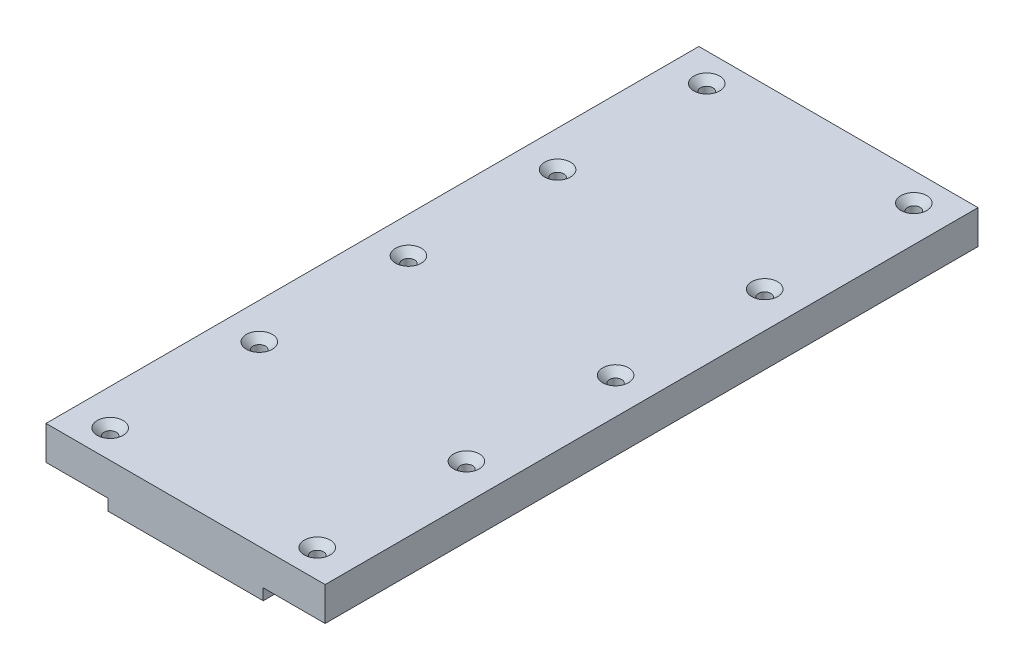
ISO-10303-21;
HEADER;
FILE_DESCRIPTION(('STEP AP214'),'2;1');
FILE_NAME('part.step','',(''),(''),'','','');
FILE_SCHEMA(('AUTOMOTIVE_DESIGN { 1 0 10303 214 1 1 1 1 }'));
ENDSEC;
DATA;
#1=APPLICATION_CONTEXT('core data for automotive mechanical design processes');
#2=APPLICATION_PROTOCOL_DEFINITION('international standard','automotive_design',2000,#1);
#3=PRODUCT_CONTEXT('',#1,'mechanical');
#4=PRODUCT('Part','Part','',(#3));
#5=PRODUCT_RELATED_PRODUCT_CATEGORY('part','',(#4));
#6=PRODUCT_DEFINITION_FORMATION('','',#4);
#7=PRODUCT_DEFINITION_CONTEXT('part definition',#1,'design');
#8=PRODUCT_DEFINITION('design','',#6,#7);
#9=PRODUCT_DEFINITION_SHAPE('','',#8);
#10=(LENGTH_UNIT() NAMED_UNIT(*) SI_UNIT(.MILLI.,.METRE.));
#11=(NAMED_UNIT(*) PLANE_ANGLE_UNIT() SI_UNIT($,.RADIAN.));
#12=(NAMED_UNIT(*) SI_UNIT($,.STERADIAN.) SOLID_ANGLE_UNIT());
#13=UNCERTAINTY_MEASURE_WITH_UNIT(LENGTH_MEASURE(1.E-05),#10,'distance_accuracy_value','');
#14=(GEOMETRIC_REPRESENTATION_CONTEXT(3) GLOBAL_UNCERTAINTY_ASSIGNED_CONTEXT((#13)) GLOBAL_UNIT_ASSIGNED_CONTEXT((#10,
#11,#12)) REPRESENTATION_CONTEXT('',''));
#15=CARTESIAN_POINT('',(0.,0.,0.));
#16=DIRECTION('',(0.,0.,1.));
#17=DIRECTION('',(1.,0.,0.));
#18=AXIS2_PLACEMENT_3D('',#15,#16,#17);
#19=CARTESIAN_POINT('',(0.,30.,-580.));
#20=DIRECTION('',(1.,0.,0.));
#21=DIRECTION('',(0.,0.,-1.));
#22=AXIS2_PLACEMENT_3D('',#19,#20,#21);
#23=PLANE('',#22);
#24=DIRECTION('',(0.,1.,0.));
#25=VECTOR('',#24,1.);
#26=CARTESIAN_POINT('',(0.,30.,0.));
#27=LINE('',#26,#25);
#28=CARTESIAN_POINT('',(0.,0.,0.));
#29=VERTEX_POINT('',#28);
#30=CARTESIAN_POINT('',(0.,30.,0.));
#31=VERTEX_POINT('',#30);
#32=EDGE_CURVE('E141',#29,#31,#27,.T.);
#33=ORIENTED_EDGE('',*,*,#32,.F.);
#34=DIRECTION('',(0.,0.,1.));
#35=VECTOR('',#34,1.);
#36=CARTESIAN_POINT('',(0.,0.,-580.));
#37=LINE('',#36,#35);
#38=CARTESIAN_POINT('',(0.,0.,-580.));
#39=VERTEX_POINT('',#38);
#40=EDGE_CURVE('E58',#39,#29,#37,.T.);
#41=ORIENTED_EDGE('',*,*,#40,.F.);
#42=DIRECTION('',(0.,1.,0.));
#43=VECTOR('',#42,1.);
#44=CARTESIAN_POINT('',(0.,30.,-580.));
#45=LINE('',#44,#43);
#46=CARTESIAN_POINT('',(0.,30.,-580.));
#47=VERTEX_POINT('',#46);
#48=EDGE_CURVE('E163',#39,#47,#45,.T.);
#49=ORIENTED_EDGE('',*,*,#48,.T.);
#50=DIRECTION('',(0.,0.,1.));
#51=VECTOR('',#50,1.);
#52=CARTESIAN_POINT('',(0.,30.,-580.));
#53=LINE('',#52,#51);
#54=EDGE_CURVE('E99',#47,#31,#53,.T.);
#55=ORIENTED_EDGE('',*,*,#54,.T.);
#56=EDGE_LOOP('',(#33,#41,#49,#55));
#57=FACE_BOUND('',#56,.T.);
#58=ADVANCED_FACE('F40',(#57),#23,.T.);
#59=CARTESIAN_POINT('',(0.,0.,-580.));
#60=DIRECTION('',(0.,-1.,0.));
#61=DIRECTION('',(0.,0.,-1.));
#62=AXIS2_PLACEMENT_3D('',#59,#60,#61);
#63=PLANE('',#62);
#64=CARTESIAN_POINT('',(-31.9999999999945,0.,-24.9999999999999));
#65=DIRECTION('',(0.,-1.,0.));
#66=DIRECTION('',(0.,0.,-1.));
#67=AXIS2_PLACEMENT_3D('',#64,#65,#66);
#68=CIRCLE('',#67,5.50000000000002);
#69=CARTESIAN_POINT('',(-31.9999999999945,0.,-30.4999999999999));
#70=VERTEX_POINT('',#69);
#71=EDGE_CURVE('E329',#70,#70,#68,.F.);
#72=ORIENTED_EDGE('',*,*,#71,.T.);
#73=EDGE_LOOP('',(#72));
#74=FACE_BOUND('',#73,.T.);
#75=CARTESIAN_POINT('',(-31.9999999999959,0.,-157.5));
#76=DIRECTION('',(0.,-1.,0.));
#77=DIRECTION('',(0.,0.,-1.));
#78=AXIS2_PLACEMENT_3D('',#75,#76,#77);
#79=CIRCLE('',#78,5.50000000000002);
#80=CARTESIAN_POINT('',(-31.9999999999959,0.,-163.));
#81=VERTEX_POINT('',#80);
#82=EDGE_CURVE('E333',#81,#81,#79,.F.);
#83=ORIENTED_EDGE('',*,*,#82,.T.);
#84=EDGE_LOOP('',(#83));
#85=FACE_BOUND('',#84,.T.);
#86=CARTESIAN_POINT('',(-31.9999999999973,0.,-290.));
#87=DIRECTION('',(0.,-1.,0.));
#88=DIRECTION('',(0.,0.,-1.));
#89=AXIS2_PLACEMENT_3D('',#86,#87,#88);
#90=CIRCLE('',#89,5.50000000000002);
#91=CARTESIAN_POINT('',(-31.9999999999973,0.,-295.5));
#92=VERTEX_POINT('',#91);
#93=EDGE_CURVE('E346',#92,#92,#90,.F.);
#94=ORIENTED_EDGE('',*,*,#93,.T.);
#95=EDGE_LOOP('',(#94));
#96=FACE_BOUND('',#95,.T.);
#97=CARTESIAN_POINT('',(-31.9999999999986,0.,-422.5));
#98=DIRECTION('',(0.,-1.,0.));
#99=DIRECTION('',(0.,0.,-1.));
#100=AXIS2_PLACEMENT_3D('',#97,#98,#99);
#101=CIRCLE('',#100,5.50000000000002);
#102=CARTESIAN_POINT('',(-31.9999999999986,0.,-428.));
#103=VERTEX_POINT('',#102);
#104=EDGE_CURVE('E343',#103,#103,#101,.F.);
#105=ORIENTED_EDGE('',*,*,#104,.T.);
#106=EDGE_LOOP('',(#105));
#107=FACE_BOUND('',#106,.T.);
#108=CARTESIAN_POINT('',(-32.,0.,-555.));
#109=DIRECTION('',(0.,-1.,0.));
#110=DIRECTION('',(0.,0.,-1.));
#111=AXIS2_PLACEMENT_3D('',#108,#109,#110);
#112=CIRCLE('',#111,5.50000000000002);
#113=CARTESIAN_POINT('',(-32.,0.,-560.5));
#114=VERTEX_POINT('',#113);
#115=EDGE_CURVE('E340',#114,#114,#112,.F.);
#116=ORIENTED_EDGE('',*,*,#115,.T.);
#117=EDGE_LOOP('',(#116));
#118=FACE_BOUND('',#117,.T.);
#119=DIRECTION('',(1.,0.,0.));
#120=VECTOR('',#119,1.);
#121=CARTESIAN_POINT('',(0.,0.,0.));
#122=LINE('',#121,#120);
#123=CARTESIAN_POINT('',(-55.,0.,0.));
#124=VERTEX_POINT('',#123);
#125=EDGE_CURVE('E160',#124,#29,#122,.T.);
#126=ORIENTED_EDGE('',*,*,#125,.F.);
#127=DIRECTION('',(0.,0.,1.));
#128=VECTOR('',#127,1.);
#129=CARTESIAN_POINT('',(-55.,0.,-580.));
#130=LINE('',#129,#128);
#131=CARTESIAN_POINT('',(-55.,0.,-580.));
#132=VERTEX_POINT('',#131);
#133=EDGE_CURVE('E87',#132,#124,#130,.T.);
#134=ORIENTED_EDGE('',*,*,#133,.F.);
#135=DIRECTION('',(1.,0.,0.));
#136=VECTOR('',#135,1.);
#137=CARTESIAN_POINT('',(0.,0.,-580.));
#138=LINE('',#137,#136);
#139=EDGE_CURVE('E131',#132,#39,#138,.T.);
#140=ORIENTED_EDGE('',*,*,#139,.T.);
#141=ORIENTED_EDGE('',*,*,#40,.T.);
#142=EDGE_LOOP('',(#126,#134,#140,#141));
#143=FACE_BOUND('',#142,.T.);
#144=ADVANCED_FACE('F248',(#74,#85,#96,#107,#118,#143),#63,.T.);
#145=CARTESIAN_POINT('',(-55.,0.,-580.));
#146=DIRECTION('',(1.,0.,0.));
#147=DIRECTION('',(0.,0.,-1.));
#148=AXIS2_PLACEMENT_3D('',#145,#146,#147);
#149=PLANE('',#148);
#150=DIRECTION('',(0.,1.,0.));
#151=VECTOR('',#150,1.);
#152=CARTESIAN_POINT('',(-55.,0.,0.));
#153=LINE('',#152,#151);
#154=CARTESIAN_POINT('',(-55.,-10.,0.));
#155=VERTEX_POINT('',#154);
#156=EDGE_CURVE('E118',#155,#124,#153,.T.);
#157=ORIENTED_EDGE('',*,*,#156,.F.);
#158=DIRECTION('',(0.,0.,1.));
#159=VECTOR('',#158,1.);
#160=CARTESIAN_POINT('',(-55.,-10.,-580.));
#161=LINE('',#160,#159);
#162=CARTESIAN_POINT('',(-55.,-10.,-580.));
#163=VERTEX_POINT('',#162);
#164=EDGE_CURVE('E113',#163,#155,#161,.T.);
#165=ORIENTED_EDGE('',*,*,#164,.F.);
#166=DIRECTION('',(0.,1.,0.));
#167=VECTOR('',#166,1.);
#168=CARTESIAN_POINT('',(-55.,0.,-580.));
#169=LINE('',#168,#167);
#170=EDGE_CURVE('E116',#163,#132,#169,.T.);
#171=ORIENTED_EDGE('',*,*,#170,.T.);
#172=ORIENTED_EDGE('',*,*,#133,.T.);
#173=EDGE_LOOP('',(#157,#165,#171,#172));
#174=FACE_BOUND('',#173,.T.);
#175=ADVANCED_FACE('F115',(#174),#149,.T.);
#176=CARTESIAN_POINT('',(-55.,-10.,-580.));
#177=DIRECTION('',(0.,-1.,0.));
#178=DIRECTION('',(0.,0.,-1.));
#179=AXIS2_PLACEMENT_3D('',#176,#177,#178);
#180=PLANE('',#179);
#181=DIRECTION('',(1.,0.,0.));
#182=VECTOR('',#181,1.);
#183=CARTESIAN_POINT('',(-55.,-10.,0.));
#184=LINE('',#183,#182);
#185=CARTESIAN_POINT('',(-193.,-10.,0.));
#186=VERTEX_POINT('',#185);
#187=EDGE_CURVE('E157',#186,#155,#184,.T.);
#188=ORIENTED_EDGE('',*,*,#187,.F.);
#189=DIRECTION('',(0.,0.,1.));
#190=VECTOR('',#189,1.);
#191=CARTESIAN_POINT('',(-193.,-10.,-580.));
#192=LINE('',#191,#190);
#193=CARTESIAN_POINT('',(-193.,-10.,-580.));
#194=VERTEX_POINT('',#193);
#195=EDGE_CURVE('E123',#194,#186,#192,.T.);
#196=ORIENTED_EDGE('',*,*,#195,.F.);
#197=DIRECTION('',(1.,0.,0.));
#198=VECTOR('',#197,1.);
#199=CARTESIAN_POINT('',(-55.,-10.,-580.));
#200=LINE('',#199,#198);
#201=EDGE_CURVE('E129',#194,#163,#200,.T.);
#202=ORIENTED_EDGE('',*,*,#201,.T.);
#203=ORIENTED_EDGE('',*,*,#164,.T.);
#204=EDGE_LOOP('',(#188,#196,#202,#203));
#205=FACE_BOUND('',#204,.T.);
#206=ADVANCED_FACE('F133',(#205),#180,.T.);
#207=CARTESIAN_POINT('',(-193.,-10.,-580.));
#208=DIRECTION('',(-1.,0.,0.));
#209=DIRECTION('',(0.,0.,1.));
#210=AXIS2_PLACEMENT_3D('',#207,#208,#209);
#211=PLANE('',#210);
#212=DIRECTION('',(0.,-1.,0.));
#213=VECTOR('',#212,1.);
#214=CARTESIAN_POINT('',(-193.,-10.,0.));
#215=LINE('',#214,#213);
#216=CARTESIAN_POINT('',(-193.,0.,0.));
#217=VERTEX_POINT('',#216);
#218=EDGE_CURVE('E154',#217,#186,#215,.T.);
#219=ORIENTED_EDGE('',*,*,#218,.F.);
#220=DIRECTION('',(0.,0.,1.));
#221=VECTOR('',#220,1.);
#222=CARTESIAN_POINT('',(-193.,0.,-580.));
#223=LINE('',#222,#221);
#224=CARTESIAN_POINT('',(-193.,0.,-580.));
#225=VERTEX_POINT('',#224);
#226=EDGE_CURVE('E168',#225,#217,#223,.T.);
#227=ORIENTED_EDGE('',*,*,#226,.F.);
#228=DIRECTION('',(0.,-1.,0.));
#229=VECTOR('',#228,1.);
#230=CARTESIAN_POINT('',(-193.,-10.,-580.));
#231=LINE('',#230,#229);
#232=EDGE_CURVE('E134',#225,#194,#231,.T.);
#233=ORIENTED_EDGE('',*,*,#232,.T.);
#234=ORIENTED_EDGE('',*,*,#195,.T.);
#235=EDGE_LOOP('',(#219,#227,#233,#234));
#236=FACE_BOUND('',#235,.T.);
#237=ADVANCED_FACE('F371',(#236),#211,.T.);
#238=CARTESIAN_POINT('',(-193.,0.,-580.));
#239=DIRECTION('',(0.,-1.,0.));
#240=DIRECTION('',(0.,0.,-1.));
#241=AXIS2_PLACEMENT_3D('',#238,#239,#240);
#242=PLANE('',#241);
#243=CARTESIAN_POINT('',(-215.999999999999,0.,-422.5));
#244=DIRECTION('',(0.,-1.,0.));
#245=DIRECTION('',(0.,0.,-1.));
#246=AXIS2_PLACEMENT_3D('',#243,#244,#245);
#247=CIRCLE('',#246,5.50000000000002);
#248=CARTESIAN_POINT('',(-215.999999999999,0.,-428.));
#249=VERTEX_POINT('',#248);
#250=EDGE_CURVE('E327',#249,#249,#247,.F.);
#251=ORIENTED_EDGE('',*,*,#250,.T.);
#252=EDGE_LOOP('',(#251));
#253=FACE_BOUND('',#252,.T.);
#254=CARTESIAN_POINT('',(-215.999999999997,0.,-290.));
#255=DIRECTION('',(0.,-1.,0.));
#256=DIRECTION('',(0.,0.,-1.));
#257=AXIS2_PLACEMENT_3D('',#254,#255,#256);
#258=CIRCLE('',#257,5.50000000000002);
#259=CARTESIAN_POINT('',(-215.999999999997,0.,-295.5));
#260=VERTEX_POINT('',#259);
#261=EDGE_CURVE('E330',#260,#260,#258,.F.);
#262=ORIENTED_EDGE('',*,*,#261,.T.);
#263=EDGE_LOOP('',(#262));
#264=FACE_BOUND('',#263,.T.);
#265=CARTESIAN_POINT('',(-215.999999999996,0.,-157.5));
#266=DIRECTION('',(0.,-1.,0.));
#267=DIRECTION('',(0.,0.,-1.));
#268=AXIS2_PLACEMENT_3D('',#265,#266,#267);
#269=CIRCLE('',#268,5.50000000000002);
#270=CARTESIAN_POINT('',(-215.999999999996,0.,-163.));
#271=VERTEX_POINT('',#270);
#272=EDGE_CURVE('E336',#271,#271,#269,.F.);
#273=ORIENTED_EDGE('',*,*,#272,.T.);
#274=EDGE_LOOP('',(#273));
#275=FACE_BOUND('',#274,.T.);
#276=CARTESIAN_POINT('',(-215.999999999994,0.,-24.9999999999999));
#277=DIRECTION('',(0.,-1.,0.));
#278=DIRECTION('',(0.,0.,-1.));
#279=AXIS2_PLACEMENT_3D('',#276,#277,#278);
#280=CIRCLE('',#279,5.50000000000002);
#281=CARTESIAN_POINT('',(-215.999999999994,0.,-30.4999999999999));
#282=VERTEX_POINT('',#281);
#283=EDGE_CURVE('E418',#282,#282,#280,.F.);
#284=ORIENTED_EDGE('',*,*,#283,.T.);
#285=EDGE_LOOP('',(#284));
#286=FACE_BOUND('',#285,.T.);
#287=CARTESIAN_POINT('',(-216.,0.,-555.));
#288=DIRECTION('',(0.,-1.,0.));
#289=DIRECTION('',(0.,0.,-1.));
#290=AXIS2_PLACEMENT_3D('',#287,#288,#289);
#291=CIRCLE('',#290,5.50000000000002);
#292=CARTESIAN_POINT('',(-216.,0.,-560.5));
#293=VERTEX_POINT('',#292);
#294=EDGE_CURVE('E145',#293,#293,#291,.F.);
#295=ORIENTED_EDGE('',*,*,#294,.T.);
#296=EDGE_LOOP('',(#295));
#297=FACE_BOUND('',#296,.T.);
#298=DIRECTION('',(1.,0.,0.));
#299=VECTOR('',#298,1.);
#300=CARTESIAN_POINT('',(-193.,0.,0.));
#301=LINE('',#300,#299);
#302=CARTESIAN_POINT('',(-248.,0.,0.));
#303=VERTEX_POINT('',#302);
#304=EDGE_CURVE('E151',#303,#217,#301,.T.);
#305=ORIENTED_EDGE('',*,*,#304,.F.);
#306=DIRECTION('',(0.,0.,1.));
#307=VECTOR('',#306,1.);
#308=CARTESIAN_POINT('',(-248.,0.,-580.));
#309=LINE('',#308,#307);
#310=CARTESIAN_POINT('',(-248.,0.,-580.));
#311=VERTEX_POINT('',#310);
#312=EDGE_CURVE('E170',#311,#303,#309,.T.);
#313=ORIENTED_EDGE('',*,*,#312,.F.);
#314=DIRECTION('',(1.,0.,0.));
#315=VECTOR('',#314,1.);
#316=CARTESIAN_POINT('',(-193.,0.,-580.));
#317=LINE('',#316,#315);
#318=EDGE_CURVE('E136',#311,#225,#317,.T.);
#319=ORIENTED_EDGE('',*,*,#318,.T.);
#320=ORIENTED_EDGE('',*,*,#226,.T.);
#321=EDGE_LOOP('',(#305,#313,#319,#320));
#322=FACE_BOUND('',#321,.T.);
#323=ADVANCED_FACE('F362',(#253,#264,#275,#286,#297,#322),#242,.T.);
#324=CARTESIAN_POINT('',(-248.,0.,-580.));
#325=DIRECTION('',(-1.,0.,0.));
#326=DIRECTION('',(0.,0.,1.));
#327=AXIS2_PLACEMENT_3D('',#324,#325,#326);
#328=PLANE('',#327);
#329=DIRECTION('',(0.,-1.,0.));
#330=VECTOR('',#329,1.);
#331=CARTESIAN_POINT('',(-248.,0.,0.));
#332=LINE('',#331,#330);
#333=CARTESIAN_POINT('',(-248.,30.,0.));
#334=VERTEX_POINT('',#333);
#335=EDGE_CURVE('E148',#334,#303,#332,.T.);
#336=ORIENTED_EDGE('',*,*,#335,.F.);
#337=DIRECTION('',(0.,0.,1.));
#338=VECTOR('',#337,1.);
#339=CARTESIAN_POINT('',(-248.,30.,-580.));
#340=LINE('',#339,#338);
#341=CARTESIAN_POINT('',(-248.,30.,-580.));
#342=VERTEX_POINT('',#341);
#343=EDGE_CURVE('E172',#342,#334,#340,.T.);
#344=ORIENTED_EDGE('',*,*,#343,.F.);
#345=DIRECTION('',(0.,-1.,0.));
#346=VECTOR('',#345,1.);
#347=CARTESIAN_POINT('',(-248.,0.,-580.));
#348=LINE('',#347,#346);
#349=EDGE_CURVE('E356',#342,#311,#348,.T.);
#350=ORIENTED_EDGE('',*,*,#349,.T.);
#351=ORIENTED_EDGE('',*,*,#312,.T.);
#352=EDGE_LOOP('',(#336,#344,#350,#351));
#353=FACE_BOUND('',#352,.T.);
#354=ADVANCED_FACE('F367',(#353),#328,.T.);
#355=CARTESIAN_POINT('',(-248.,30.,-580.));
#356=DIRECTION('',(0.,1.,0.));
#357=DIRECTION('',(0.,0.,1.));
#358=AXIS2_PLACEMENT_3D('',#355,#356,#357);
#359=PLANE('',#358);
#360=CARTESIAN_POINT('',(-31.9999999999945,30.,-24.9999999999999));
#361=DIRECTION('',(0.,1.,0.));
#362=DIRECTION('',(0.,0.,1.));
#363=AXIS2_PLACEMENT_3D('',#360,#361,#362);
#364=CIRCLE('',#363,11.5000000000002);
#365=CARTESIAN_POINT('',(-31.9999999999945,30.,-13.4999999999997));
#366=VERTEX_POINT('',#365);
#367=EDGE_CURVE('E204',#366,#366,#364,.F.);
#368=ORIENTED_EDGE('',*,*,#367,.T.);
#369=EDGE_LOOP('',(#368));
#370=FACE_BOUND('',#369,.T.);
#371=CARTESIAN_POINT('',(-31.9999999999959,30.,-157.5));
#372=DIRECTION('',(0.,1.,0.));
#373=DIRECTION('',(0.,0.,1.));
#374=AXIS2_PLACEMENT_3D('',#371,#372,#373);
#375=CIRCLE('',#374,11.5000000000002);
#376=CARTESIAN_POINT('',(-31.9999999999959,30.,-146.));
#377=VERTEX_POINT('',#376);
#378=EDGE_CURVE('E201',#377,#377,#375,.F.);
#379=ORIENTED_EDGE('',*,*,#378,.T.);
#380=EDGE_LOOP('',(#379));
#381=FACE_BOUND('',#380,.T.);
#382=CARTESIAN_POINT('',(-31.9999999999973,30.,-290.));
#383=DIRECTION('',(0.,1.,0.));
#384=DIRECTION('',(0.,0.,1.));
#385=AXIS2_PLACEMENT_3D('',#382,#383,#384);
#386=CIRCLE('',#385,11.5);
#387=CARTESIAN_POINT('',(-31.9999999999973,30.,-278.5));
#388=VERTEX_POINT('',#387);
#389=EDGE_CURVE('E198',#388,#388,#386,.F.);
#390=ORIENTED_EDGE('',*,*,#389,.T.);
#391=EDGE_LOOP('',(#390));
#392=FACE_BOUND('',#391,.T.);
#393=CARTESIAN_POINT('',(-31.9999999999986,30.,-422.5));
#394=DIRECTION('',(0.,1.,0.));
#395=DIRECTION('',(0.,0.,1.));
#396=AXIS2_PLACEMENT_3D('',#393,#394,#395);
#397=CIRCLE('',#396,11.5000000000002);
#398=CARTESIAN_POINT('',(-31.9999999999986,30.,-411.));
#399=VERTEX_POINT('',#398);
#400=EDGE_CURVE('E195',#399,#399,#397,.F.);
#401=ORIENTED_EDGE('',*,*,#400,.T.);
#402=EDGE_LOOP('',(#401));
#403=FACE_BOUND('',#402,.T.);
#404=CARTESIAN_POINT('',(-32.,30.,-555.));
#405=DIRECTION('',(0.,1.,0.));
#406=DIRECTION('',(0.,0.,1.));
#407=AXIS2_PLACEMENT_3D('',#404,#405,#406);
#408=CIRCLE('',#407,11.5000000000001);
#409=CARTESIAN_POINT('',(-32.,30.,-543.5));
#410=VERTEX_POINT('',#409);
#411=EDGE_CURVE('E192',#410,#410,#408,.F.);
#412=ORIENTED_EDGE('',*,*,#411,.T.);
#413=EDGE_LOOP('',(#412));
#414=FACE_BOUND('',#413,.T.);
#415=CARTESIAN_POINT('',(-216.,30.,-555.));
#416=DIRECTION('',(0.,1.,0.));
#417=DIRECTION('',(0.,0.,1.));
#418=AXIS2_PLACEMENT_3D('',#415,#416,#417);
#419=CIRCLE('',#418,11.5000000000001);
#420=CARTESIAN_POINT('',(-216.,30.,-543.5));
#421=VERTEX_POINT('',#420);
#422=EDGE_CURVE('E189',#421,#421,#419,.F.);
#423=ORIENTED_EDGE('',*,*,#422,.T.);
#424=EDGE_LOOP('',(#423));
#425=FACE_BOUND('',#424,.T.);
#426=CARTESIAN_POINT('',(-215.999999999999,30.,-422.5));
#427=DIRECTION('',(0.,1.,0.));
#428=DIRECTION('',(0.,0.,1.));
#429=AXIS2_PLACEMENT_3D('',#426,#427,#428);
#430=CIRCLE('',#429,11.5000000000002);
#431=CARTESIAN_POINT('',(-215.999999999999,30.,-411.));
#432=VERTEX_POINT('',#431);
#433=EDGE_CURVE('E186',#432,#432,#430,.F.);
#434=ORIENTED_EDGE('',*,*,#433,.T.);
#435=EDGE_LOOP('',(#434));
#436=FACE_BOUND('',#435,.T.);
#437=CARTESIAN_POINT('',(-215.999999999997,30.,-290.));
#438=DIRECTION('',(0.,1.,0.));
#439=DIRECTION('',(0.,0.,1.));
#440=AXIS2_PLACEMENT_3D('',#437,#438,#439);
#441=CIRCLE('',#440,11.5);
#442=CARTESIAN_POINT('',(-215.999999999997,30.,-278.5));
#443=VERTEX_POINT('',#442);
#444=EDGE_CURVE('E183',#443,#443,#441,.F.);
#445=ORIENTED_EDGE('',*,*,#444,.T.);
#446=EDGE_LOOP('',(#445));
#447=FACE_BOUND('',#446,.T.);
#448=CARTESIAN_POINT('',(-215.999999999996,30.,-157.5));
#449=DIRECTION('',(0.,1.,0.));
#450=DIRECTION('',(0.,0.,1.));
#451=AXIS2_PLACEMENT_3D('',#448,#449,#450);
#452=CIRCLE('',#451,11.5000000000002);
#453=CARTESIAN_POINT('',(-215.999999999996,30.,-146.));
#454=VERTEX_POINT('',#453);
#455=EDGE_CURVE('E180',#454,#454,#452,.F.);
#456=ORIENTED_EDGE('',*,*,#455,.T.);
#457=EDGE_LOOP('',(#456));
#458=FACE_BOUND('',#457,.T.);
#459=CARTESIAN_POINT('',(-215.999999999994,30.,-24.9999999999999));
#460=DIRECTION('',(0.,1.,0.));
#461=DIRECTION('',(0.,0.,1.));
#462=AXIS2_PLACEMENT_3D('',#459,#460,#461);
#463=CIRCLE('',#462,11.5000000000002);
#464=CARTESIAN_POINT('',(-215.999999999994,30.,-13.4999999999997));
#465=VERTEX_POINT('',#464);
#466=EDGE_CURVE('E177',#465,#465,#463,.F.);
#467=ORIENTED_EDGE('',*,*,#466,.T.);
#468=EDGE_LOOP('',(#467));
#469=FACE_BOUND('',#468,.T.);
#470=DIRECTION('',(-1.,0.,0.));
#471=VECTOR('',#470,1.);
#472=CARTESIAN_POINT('',(-248.,30.,0.));
#473=LINE('',#472,#471);
#474=EDGE_CURVE('E144',#31,#334,#473,.T.);
#475=ORIENTED_EDGE('',*,*,#474,.F.);
#476=ORIENTED_EDGE('',*,*,#54,.F.);
#477=DIRECTION('',(-1.,0.,0.));
#478=VECTOR('',#477,1.);
#479=CARTESIAN_POINT('',(-248.,30.,-580.));
#480=LINE('',#479,#478);
#481=EDGE_CURVE('E354',#47,#342,#480,.T.);
#482=ORIENTED_EDGE('',*,*,#481,.T.);
#483=ORIENTED_EDGE('',*,*,#343,.T.);
#484=EDGE_LOOP('',(#475,#476,#482,#483));
#485=FACE_BOUND('',#484,.T.);
#486=ADVANCED_FACE('F257',(#370,#381,#392,#403,#414,#425,#436,#447,#458,#469,#485),#359,.T.);
#487=CARTESIAN_POINT('',(0.,0.,-580.));
#488=DIRECTION('',(0.,0.,-1.));
#489=DIRECTION('',(-1.,0.,0.));
#490=AXIS2_PLACEMENT_3D('',#487,#488,#489);
#491=PLANE('',#490);
#492=ORIENTED_EDGE('',*,*,#48,.F.);
#493=ORIENTED_EDGE('',*,*,#139,.F.);
#494=ORIENTED_EDGE('',*,*,#170,.F.);
#495=ORIENTED_EDGE('',*,*,#201,.F.);
#496=ORIENTED_EDGE('',*,*,#232,.F.);
#497=ORIENTED_EDGE('',*,*,#318,.F.);
#498=ORIENTED_EDGE('',*,*,#349,.F.);
#499=ORIENTED_EDGE('',*,*,#481,.F.);
#500=EDGE_LOOP('',(#492,#493,#494,#495,#496,#497,#498,#499));
#501=FACE_BOUND('',#500,.T.);
#502=ADVANCED_FACE('F127',(#501),#491,.T.);
#503=CARTESIAN_POINT('',(0.,0.,0.));
#504=DIRECTION('',(0.,0.,-1.));
#505=DIRECTION('',(-1.,0.,0.));
#506=AXIS2_PLACEMENT_3D('',#503,#504,#505);
#507=PLANE('',#506);
#508=ORIENTED_EDGE('',*,*,#32,.T.);
#509=ORIENTED_EDGE('',*,*,#474,.T.);
#510=ORIENTED_EDGE('',*,*,#335,.T.);
#511=ORIENTED_EDGE('',*,*,#304,.T.);
#512=ORIENTED_EDGE('',*,*,#218,.T.);
#513=ORIENTED_EDGE('',*,*,#187,.T.);
#514=ORIENTED_EDGE('',*,*,#156,.T.);
#515=ORIENTED_EDGE('',*,*,#125,.T.);
#516=EDGE_LOOP('',(#508,#509,#510,#511,#512,#513,#514,#515));
#517=FACE_BOUND('',#516,.T.);
#518=ADVANCED_FACE('F369',(#517),#507,.F.);
#519=CARTESIAN_POINT('',(-216.,-10.001,-555.));
#520=DIRECTION('',(0.,1.,0.));
#521=DIRECTION('',(0.,0.,1.));
#522=AXIS2_PLACEMENT_3D('',#519,#520,#521);
#523=CYLINDRICAL_SURFACE('',#522,5.50000000000002);
#524=CARTESIAN_POINT('',(-216.,23.9999999999999,-555.));
#525=DIRECTION('',(0.,1.,0.));
#526=DIRECTION('',(0.,0.,1.));
#527=AXIS2_PLACEMENT_3D('',#524,#525,#526);
#528=CIRCLE('',#527,5.50000000000002);
#529=CARTESIAN_POINT('',(-216.,23.9999999999999,-549.5));
#530=VERTEX_POINT('',#529);
#531=EDGE_CURVE('E219',#530,#530,#528,.T.);
#532=ORIENTED_EDGE('',*,*,#531,.T.);
#533=EDGE_LOOP('',(#532));
#534=FACE_BOUND('',#533,.T.);
#535=ORIENTED_EDGE('',*,*,#294,.F.);
#536=EDGE_LOOP('',(#535));
#537=FACE_BOUND('',#536,.T.);
#538=ADVANCED_FACE('F414',(#534,#537),#523,.F.);
#539=CARTESIAN_POINT('',(-215.999999999994,-10.001,-24.9999999999999));
#540=DIRECTION('',(0.,1.,0.));
#541=DIRECTION('',(0.,0.,1.));
#542=AXIS2_PLACEMENT_3D('',#539,#540,#541);
#543=CYLINDRICAL_SURFACE('',#542,5.50000000000002);
#544=CARTESIAN_POINT('',(-215.999999999994,23.9999999999999,-24.9999999999999));
#545=DIRECTION('',(0.,1.,0.));
#546=DIRECTION('',(0.,0.,1.));
#547=AXIS2_PLACEMENT_3D('',#544,#545,#546);
#548=CIRCLE('',#547,5.50000000000002);
#549=CARTESIAN_POINT('',(-215.999999999994,23.9999999999999,-19.4999999999999));
#550=VERTEX_POINT('',#549);
#551=EDGE_CURVE('E11',#550,#550,#548,.T.);
#552=ORIENTED_EDGE('',*,*,#551,.T.);
#553=EDGE_LOOP('',(#552));
#554=FACE_BOUND('',#553,.T.);
#555=ORIENTED_EDGE('',*,*,#283,.F.);
#556=EDGE_LOOP('',(#555));
#557=FACE_BOUND('',#556,.T.);
#558=ADVANCED_FACE('F410',(#554,#557),#543,.F.);
#559=CARTESIAN_POINT('',(-32.,-10.001,-555.));
#560=DIRECTION('',(0.,1.,0.));
#561=DIRECTION('',(0.,0.,1.));
#562=AXIS2_PLACEMENT_3D('',#559,#560,#561);
#563=CYLINDRICAL_SURFACE('',#562,5.50000000000002);
#564=CARTESIAN_POINT('',(-32.,23.9999999999999,-555.));
#565=DIRECTION('',(0.,1.,0.));
#566=DIRECTION('',(0.,0.,1.));
#567=AXIS2_PLACEMENT_3D('',#564,#565,#566);
#568=CIRCLE('',#567,5.50000000000002);
#569=CARTESIAN_POINT('',(-32.,23.9999999999999,-549.5));
#570=VERTEX_POINT('',#569);
#571=EDGE_CURVE('E216',#570,#570,#568,.T.);
#572=ORIENTED_EDGE('',*,*,#571,.T.);
#573=EDGE_LOOP('',(#572));
#574=FACE_BOUND('',#573,.T.);
#575=ORIENTED_EDGE('',*,*,#115,.F.);
#576=EDGE_LOOP('',(#575));
#577=FACE_BOUND('',#576,.T.);
#578=ADVANCED_FACE('F413',(#574,#577),#563,.F.);
#579=CARTESIAN_POINT('',(-31.9999999999986,-10.001,-422.5));
#580=DIRECTION('',(0.,1.,0.));
#581=DIRECTION('',(0.,0.,1.));
#582=AXIS2_PLACEMENT_3D('',#579,#580,#581);
#583=CYLINDRICAL_SURFACE('',#582,5.50000000000002);
#584=CARTESIAN_POINT('',(-31.9999999999986,23.9999999999999,-422.5));
#585=DIRECTION('',(0.,1.,0.));
#586=DIRECTION('',(0.,0.,1.));
#587=AXIS2_PLACEMENT_3D('',#584,#585,#586);
#588=CIRCLE('',#587,5.50000000000002);
#589=CARTESIAN_POINT('',(-31.9999999999986,23.9999999999999,-417.));
#590=VERTEX_POINT('',#589);
#591=EDGE_CURVE('E213',#590,#590,#588,.T.);
#592=ORIENTED_EDGE('',*,*,#591,.T.);
#593=EDGE_LOOP('',(#592));
#594=FACE_BOUND('',#593,.T.);
#595=ORIENTED_EDGE('',*,*,#104,.F.);
#596=EDGE_LOOP('',(#595));
#597=FACE_BOUND('',#596,.T.);
#598=ADVANCED_FACE('F442',(#594,#597),#583,.F.);
#599=CARTESIAN_POINT('',(-31.9999999999973,-10.001,-290.));
#600=DIRECTION('',(0.,1.,0.));
#601=DIRECTION('',(0.,0.,1.));
#602=AXIS2_PLACEMENT_3D('',#599,#600,#601);
#603=CYLINDRICAL_SURFACE('',#602,5.50000000000002);
#604=CARTESIAN_POINT('',(-31.9999999999973,24.,-290.));
#605=DIRECTION('',(0.,1.,0.));
#606=DIRECTION('',(0.,0.,1.));
#607=AXIS2_PLACEMENT_3D('',#604,#605,#606);
#608=CIRCLE('',#607,5.50000000000002);
#609=CARTESIAN_POINT('',(-31.9999999999973,24.,-284.5));
#610=VERTEX_POINT('',#609);
#611=EDGE_CURVE('E210',#610,#610,#608,.T.);
#612=ORIENTED_EDGE('',*,*,#611,.T.);
#613=EDGE_LOOP('',(#612));
#614=FACE_BOUND('',#613,.T.);
#615=ORIENTED_EDGE('',*,*,#93,.F.);
#616=EDGE_LOOP('',(#615));
#617=FACE_BOUND('',#616,.T.);
#618=ADVANCED_FACE('F433',(#614,#617),#603,.F.);
#619=CARTESIAN_POINT('',(-31.9999999999959,-10.001,-157.5));
#620=DIRECTION('',(0.,1.,0.));
#621=DIRECTION('',(0.,0.,1.));
#622=AXIS2_PLACEMENT_3D('',#619,#620,#621);
#623=CYLINDRICAL_SURFACE('',#622,5.50000000000002);
#624=CARTESIAN_POINT('',(-31.9999999999959,23.9999999999999,-157.5));
#625=DIRECTION('',(0.,1.,0.));
#626=DIRECTION('',(0.,0.,1.));
#627=AXIS2_PLACEMENT_3D('',#624,#625,#626);
#628=CIRCLE('',#627,5.50000000000002);
#629=CARTESIAN_POINT('',(-31.9999999999959,23.9999999999999,-152.));
#630=VERTEX_POINT('',#629);
#631=EDGE_CURVE('E207',#630,#630,#628,.T.);
#632=ORIENTED_EDGE('',*,*,#631,.T.);
#633=EDGE_LOOP('',(#632));
#634=FACE_BOUND('',#633,.T.);
#635=ORIENTED_EDGE('',*,*,#82,.F.);
#636=EDGE_LOOP('',(#635));
#637=FACE_BOUND('',#636,.T.);
#638=ADVANCED_FACE('F425',(#634,#637),#623,.F.);
#639=CARTESIAN_POINT('',(-215.999999999996,-10.001,-157.5));
#640=DIRECTION('',(0.,1.,0.));
#641=DIRECTION('',(0.,0.,1.));
#642=AXIS2_PLACEMENT_3D('',#639,#640,#641);
#643=CYLINDRICAL_SURFACE('',#642,5.50000000000002);
#644=CARTESIAN_POINT('',(-215.999999999996,23.9999999999999,-157.5));
#645=DIRECTION('',(0.,1.,0.));
#646=DIRECTION('',(0.,0.,1.));
#647=AXIS2_PLACEMENT_3D('',#644,#645,#646);
#648=CIRCLE('',#647,5.50000000000002);
#649=CARTESIAN_POINT('',(-215.999999999996,23.9999999999999,-152.));
#650=VERTEX_POINT('',#649);
#651=EDGE_CURVE('E50',#650,#650,#648,.T.);
#652=ORIENTED_EDGE('',*,*,#651,.T.);
#653=EDGE_LOOP('',(#652));
#654=FACE_BOUND('',#653,.T.);
#655=ORIENTED_EDGE('',*,*,#272,.F.);
#656=EDGE_LOOP('',(#655));
#657=FACE_BOUND('',#656,.T.);
#658=ADVANCED_FACE('F230',(#654,#657),#643,.F.);
#659=CARTESIAN_POINT('',(-215.999999999997,-10.001,-290.));
#660=DIRECTION('',(0.,1.,0.));
#661=DIRECTION('',(0.,0.,1.));
#662=AXIS2_PLACEMENT_3D('',#659,#660,#661);
#663=CYLINDRICAL_SURFACE('',#662,5.50000000000002);
#664=CARTESIAN_POINT('',(-215.999999999997,24.,-290.));
#665=DIRECTION('',(0.,1.,0.));
#666=DIRECTION('',(0.,0.,1.));
#667=AXIS2_PLACEMENT_3D('',#664,#665,#666);
#668=CIRCLE('',#667,5.50000000000002);
#669=CARTESIAN_POINT('',(-215.999999999997,24.,-284.5));
#670=VERTEX_POINT('',#669);
#671=EDGE_CURVE('E225',#670,#670,#668,.T.);
#672=ORIENTED_EDGE('',*,*,#671,.T.);
#673=EDGE_LOOP('',(#672));
#674=FACE_BOUND('',#673,.T.);
#675=ORIENTED_EDGE('',*,*,#261,.F.);
#676=EDGE_LOOP('',(#675));
#677=FACE_BOUND('',#676,.T.);
#678=ADVANCED_FACE('F323',(#674,#677),#663,.F.);
#679=CARTESIAN_POINT('',(-215.999999999999,-10.001,-422.5));
#680=DIRECTION('',(0.,1.,0.));
#681=DIRECTION('',(0.,0.,1.));
#682=AXIS2_PLACEMENT_3D('',#679,#680,#681);
#683=CYLINDRICAL_SURFACE('',#682,5.50000000000002);
#684=CARTESIAN_POINT('',(-215.999999999999,23.9999999999999,-422.5));
#685=DIRECTION('',(0.,1.,0.));
#686=DIRECTION('',(0.,0.,1.));
#687=AXIS2_PLACEMENT_3D('',#684,#685,#686);
#688=CIRCLE('',#687,5.50000000000002);
#689=CARTESIAN_POINT('',(-215.999999999999,23.9999999999999,-417.));
#690=VERTEX_POINT('',#689);
#691=EDGE_CURVE('E222',#690,#690,#688,.T.);
#692=ORIENTED_EDGE('',*,*,#691,.T.);
#693=EDGE_LOOP('',(#692));
#694=FACE_BOUND('',#693,.T.);
#695=ORIENTED_EDGE('',*,*,#250,.F.);
#696=EDGE_LOOP('',(#695));
#697=FACE_BOUND('',#696,.T.);
#698=ADVANCED_FACE('F320',(#694,#697),#683,.F.);
#699=CARTESIAN_POINT('',(-31.9999999999945,-10.001,-24.9999999999999));
#700=DIRECTION('',(0.,1.,0.));
#701=DIRECTION('',(0.,0.,1.));
#702=AXIS2_PLACEMENT_3D('',#699,#700,#701);
#703=CYLINDRICAL_SURFACE('',#702,5.50000000000002);
#704=CARTESIAN_POINT('',(-31.9999999999945,23.9999999999999,-24.9999999999999));
#705=DIRECTION('',(0.,1.,0.));
#706=DIRECTION('',(0.,0.,1.));
#707=AXIS2_PLACEMENT_3D('',#704,#705,#706);
#708=CIRCLE('',#707,5.50000000000002);
#709=CARTESIAN_POINT('',(-31.9999999999945,23.9999999999999,-19.4999999999999));
#710=VERTEX_POINT('',#709);
#711=EDGE_CURVE('E165',#710,#710,#708,.T.);
#712=ORIENTED_EDGE('',*,*,#711,.T.);
#713=EDGE_LOOP('',(#712));
#714=FACE_BOUND('',#713,.T.);
#715=ORIENTED_EDGE('',*,*,#71,.F.);
#716=EDGE_LOOP('',(#715));
#717=FACE_BOUND('',#716,.T.);
#718=ADVANCED_FACE('F267',(#714,#717),#703,.F.);
#719=CARTESIAN_POINT('',(-31.9999999999945,23.9999999999999,-24.9999999999999));
#720=DIRECTION('',(0.,1.,0.));
#721=DIRECTION('',(0.,0.,1.));
#722=AXIS2_PLACEMENT_3D('',#719,#720,#721);
#723=CONICAL_SURFACE('',#722,5.50000000000002,0.785398163397451);
#724=ORIENTED_EDGE('',*,*,#367,.F.);
#725=EDGE_LOOP('',(#724));
#726=FACE_BOUND('',#725,.T.);
#727=ORIENTED_EDGE('',*,*,#711,.F.);
#728=EDGE_LOOP('',(#727));
#729=FACE_BOUND('',#728,.T.);
#730=ADVANCED_FACE('F260',(#726,#729),#723,.F.);
#731=CARTESIAN_POINT('',(-31.9999999999959,23.9999999999999,-157.5));
#732=DIRECTION('',(0.,1.,0.));
#733=DIRECTION('',(0.,0.,1.));
#734=AXIS2_PLACEMENT_3D('',#731,#732,#733);
#735=CONICAL_SURFACE('',#734,5.50000000000002,0.785398163397451);
#736=ORIENTED_EDGE('',*,*,#378,.F.);
#737=EDGE_LOOP('',(#736));
#738=FACE_BOUND('',#737,.T.);
#739=ORIENTED_EDGE('',*,*,#631,.F.);
#740=EDGE_LOOP('',(#739));
#741=FACE_BOUND('',#740,.T.);
#742=ADVANCED_FACE('F266',(#738,#741),#735,.F.);
#743=CARTESIAN_POINT('',(-31.9999999999973,24.,-290.));
#744=DIRECTION('',(0.,1.,0.));
#745=DIRECTION('',(0.,0.,1.));
#746=AXIS2_PLACEMENT_3D('',#743,#744,#745);
#747=CONICAL_SURFACE('',#746,5.50000000000002,0.785398163397451);
#748=ORIENTED_EDGE('',*,*,#389,.F.);
#749=EDGE_LOOP('',(#748));
#750=FACE_BOUND('',#749,.T.);
#751=ORIENTED_EDGE('',*,*,#611,.F.);
#752=EDGE_LOOP('',(#751));
#753=FACE_BOUND('',#752,.T.);
#754=ADVANCED_FACE('F274',(#750,#753),#747,.F.);
#755=CARTESIAN_POINT('',(-31.9999999999986,23.9999999999999,-422.5));
#756=DIRECTION('',(0.,1.,0.));
#757=DIRECTION('',(0.,0.,1.));
#758=AXIS2_PLACEMENT_3D('',#755,#756,#757);
#759=CONICAL_SURFACE('',#758,5.50000000000002,0.785398163397451);
#760=ORIENTED_EDGE('',*,*,#400,.F.);
#761=EDGE_LOOP('',(#760));
#762=FACE_BOUND('',#761,.T.);
#763=ORIENTED_EDGE('',*,*,#591,.F.);
#764=EDGE_LOOP('',(#763));
#765=FACE_BOUND('',#764,.T.);
#766=ADVANCED_FACE('F281',(#762,#765),#759,.F.);
#767=CARTESIAN_POINT('',(-32.,23.9999999999999,-555.));
#768=DIRECTION('',(0.,1.,0.));
#769=DIRECTION('',(0.,0.,1.));
#770=AXIS2_PLACEMENT_3D('',#767,#768,#769);
#771=CONICAL_SURFACE('',#770,5.50000000000002,0.785398163397442);
#772=ORIENTED_EDGE('',*,*,#411,.F.);
#773=EDGE_LOOP('',(#772));
#774=FACE_BOUND('',#773,.T.);
#775=ORIENTED_EDGE('',*,*,#571,.F.);
#776=EDGE_LOOP('',(#775));
#777=FACE_BOUND('',#776,.T.);
#778=ADVANCED_FACE('F288',(#774,#777),#771,.F.);
#779=CARTESIAN_POINT('',(-216.,23.9999999999999,-555.));
#780=DIRECTION('',(0.,1.,0.));
#781=DIRECTION('',(0.,0.,1.));
#782=AXIS2_PLACEMENT_3D('',#779,#780,#781);
#783=CONICAL_SURFACE('',#782,5.50000000000002,0.785398163397442);
#784=ORIENTED_EDGE('',*,*,#422,.F.);
#785=EDGE_LOOP('',(#784));
#786=FACE_BOUND('',#785,.T.);
#787=ORIENTED_EDGE('',*,*,#531,.F.);
#788=EDGE_LOOP('',(#787));
#789=FACE_BOUND('',#788,.T.);
#790=ADVANCED_FACE('F295',(#786,#789),#783,.F.);
#791=CARTESIAN_POINT('',(-215.999999999999,23.9999999999999,-422.5));
#792=DIRECTION('',(0.,1.,0.));
#793=DIRECTION('',(0.,0.,1.));
#794=AXIS2_PLACEMENT_3D('',#791,#792,#793);
#795=CONICAL_SURFACE('',#794,5.50000000000002,0.785398163397451);
#796=ORIENTED_EDGE('',*,*,#433,.F.);
#797=EDGE_LOOP('',(#796));
#798=FACE_BOUND('',#797,.T.);
#799=ORIENTED_EDGE('',*,*,#691,.F.);
#800=EDGE_LOOP('',(#799));
#801=FACE_BOUND('',#800,.T.);
#802=ADVANCED_FACE('F242',(#798,#801),#795,.F.);
#803=CARTESIAN_POINT('',(-215.999999999997,24.,-290.));
#804=DIRECTION('',(0.,1.,0.));
#805=DIRECTION('',(0.,0.,1.));
#806=AXIS2_PLACEMENT_3D('',#803,#804,#805);
#807=CONICAL_SURFACE('',#806,5.50000000000002,0.785398163397451);
#808=ORIENTED_EDGE('',*,*,#444,.F.);
#809=EDGE_LOOP('',(#808));
#810=FACE_BOUND('',#809,.T.);
#811=ORIENTED_EDGE('',*,*,#671,.F.);
#812=EDGE_LOOP('',(#811));
#813=FACE_BOUND('',#812,.T.);
#814=ADVANCED_FACE('F235',(#810,#813),#807,.F.);
#815=CARTESIAN_POINT('',(-215.999999999996,23.9999999999999,-157.5));
#816=DIRECTION('',(0.,1.,0.));
#817=DIRECTION('',(0.,0.,1.));
#818=AXIS2_PLACEMENT_3D('',#815,#816,#817);
#819=CONICAL_SURFACE('',#818,5.50000000000002,0.785398163397451);
#820=ORIENTED_EDGE('',*,*,#455,.F.);
#821=EDGE_LOOP('',(#820));
#822=FACE_BOUND('',#821,.T.);
#823=ORIENTED_EDGE('',*,*,#651,.F.);
#824=EDGE_LOOP('',(#823));
#825=FACE_BOUND('',#824,.T.);
#826=ADVANCED_FACE('F233',(#822,#825),#819,.F.);
#827=CARTESIAN_POINT('',(-215.999999999994,23.9999999999999,-24.9999999999999));
#828=DIRECTION('',(0.,1.,0.));
#829=DIRECTION('',(0.,0.,1.));
#830=AXIS2_PLACEMENT_3D('',#827,#828,#829);
#831=CONICAL_SURFACE('',#830,5.50000000000002,0.785398163397451);
#832=ORIENTED_EDGE('',*,*,#466,.F.);
#833=EDGE_LOOP('',(#832));
#834=FACE_BOUND('',#833,.T.);
#835=ORIENTED_EDGE('',*,*,#551,.F.);
#836=EDGE_LOOP('',(#835));
#837=FACE_BOUND('',#836,.T.);
#838=ADVANCED_FACE('F43',(#834,#837),#831,.F.);
#839=CLOSED_SHELL('',(#58,#144,#175,#206,#237,#323,#354,#486,#502,#518,#538,#558,#578,#598,#618,
#638,#658,#678,#698,#718,#730,#742,#754,#766,#778,#790,#802,#814,#826,#838));
#840=MANIFOLD_SOLID_BREP('B2',#839);
#841=ADVANCED_BREP_SHAPE_REPRESENTATION('',(#18,#840),#14);
#842=SHAPE_DEFINITION_REPRESENTATION(#9,#841);
ENDSEC;
END-ISO-10303-21;
